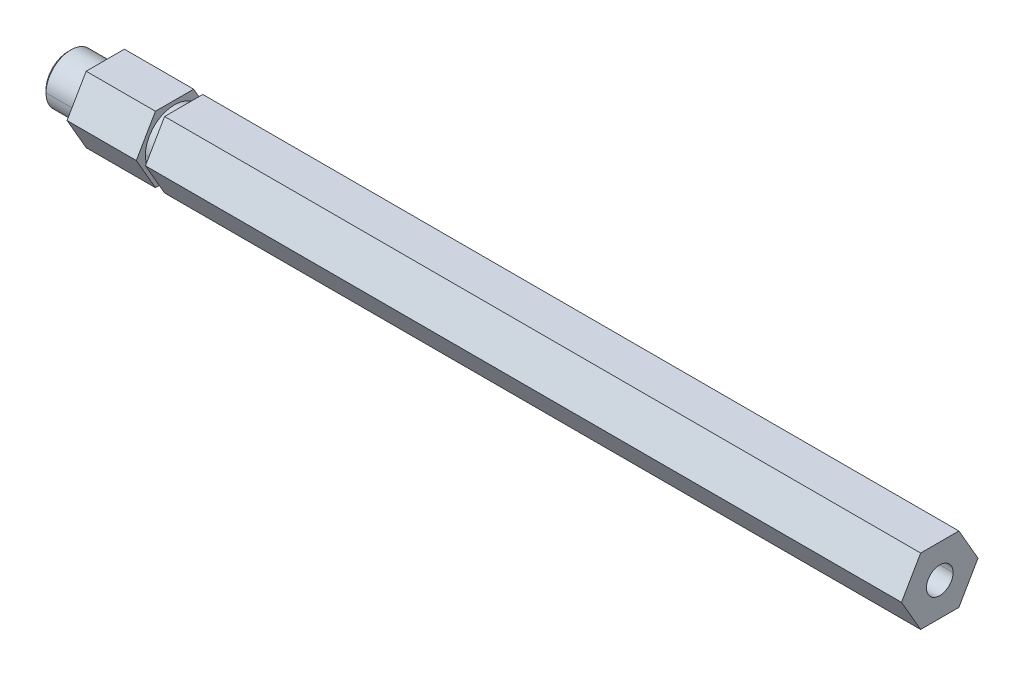
ISO-10303-21;
HEADER;
FILE_DESCRIPTION(('STEP AP214'),'2;1');
FILE_NAME('part.step','',(''),(''),'','','');
FILE_SCHEMA(('AUTOMOTIVE_DESIGN { 1 0 10303 214 1 1 1 1 }'));
ENDSEC;
DATA;
#1=APPLICATION_CONTEXT('core data for automotive mechanical design processes');
#2=APPLICATION_PROTOCOL_DEFINITION('international standard','automotive_design',2000,#1);
#3=PRODUCT_CONTEXT('',#1,'mechanical');
#4=PRODUCT('Part','Part','',(#3));
#5=PRODUCT_RELATED_PRODUCT_CATEGORY('part','',(#4));
#6=PRODUCT_DEFINITION_FORMATION('','',#4);
#7=PRODUCT_DEFINITION_CONTEXT('part definition',#1,'design');
#8=PRODUCT_DEFINITION('design','',#6,#7);
#9=PRODUCT_DEFINITION_SHAPE('','',#8);
#10=(LENGTH_UNIT() NAMED_UNIT(*) SI_UNIT(.MILLI.,.METRE.));
#11=(NAMED_UNIT(*) PLANE_ANGLE_UNIT() SI_UNIT($,.RADIAN.));
#12=(NAMED_UNIT(*) SI_UNIT($,.STERADIAN.) SOLID_ANGLE_UNIT());
#13=UNCERTAINTY_MEASURE_WITH_UNIT(LENGTH_MEASURE(1.E-05),#10,'distance_accuracy_value','');
#14=(GEOMETRIC_REPRESENTATION_CONTEXT(3) GLOBAL_UNCERTAINTY_ASSIGNED_CONTEXT((#13)) GLOBAL_UNIT_ASSIGNED_CONTEXT((#10,
#11,#12)) REPRESENTATION_CONTEXT('',''));
#15=CARTESIAN_POINT('',(0.,0.,0.));
#16=DIRECTION('',(0.,0.,1.));
#17=DIRECTION('',(1.,0.,0.));
#18=AXIS2_PLACEMENT_3D('',#15,#16,#17);
#19=CARTESIAN_POINT('',(0.507999999999975,0.,0.));
#20=DIRECTION('',(1.,0.,0.));
#21=DIRECTION('',(0.,0.,-1.));
#22=AXIS2_PLACEMENT_3D('',#19,#20,#21);
#23=CONICAL_SURFACE('',#22,4.7625,0.785398163397452);
#24=CARTESIAN_POINT('',(0.,0.,0.));
#25=DIRECTION('',(-1.,0.,0.));
#26=DIRECTION('',(0.,0.,-1.));
#27=AXIS2_PLACEMENT_3D('',#24,#25,#26);
#28=CIRCLE('',#27,4.2545);
#29=CARTESIAN_POINT('',(0.,0.,4.2545));
#30=VERTEX_POINT('',#29);
#31=CARTESIAN_POINT('',(0.,0.,-4.2545));
#32=VERTEX_POINT('',#31);
#33=EDGE_CURVE('E41',#30,#32,#28,.T.);
#34=ORIENTED_EDGE('',*,*,#33,.F.);
#35=DIRECTION('',(0.707106781186545,0.,0.70710678118655));
#36=VECTOR('',#35,1.);
#37=CARTESIAN_POINT('',(0.507999999999975,0.,4.7625));
#38=LINE('',#37,#36);
#39=CARTESIAN_POINT('',(0.507999999999975,0.,4.7625));
#40=VERTEX_POINT('',#39);
#41=EDGE_CURVE('E11',#30,#40,#38,.T.);
#42=ORIENTED_EDGE('',*,*,#41,.T.);
#43=CARTESIAN_POINT('',(0.507999999999975,0.,0.));
#44=DIRECTION('',(1.,0.,0.));
#45=DIRECTION('',(0.,0.,-1.));
#46=AXIS2_PLACEMENT_3D('',#43,#44,#45);
#47=CIRCLE('',#46,4.7625);
#48=CARTESIAN_POINT('',(0.507999999999975,0.,-4.7625));
#49=VERTEX_POINT('',#48);
#50=EDGE_CURVE('E274',#49,#40,#47,.T.);
#51=ORIENTED_EDGE('',*,*,#50,.F.);
#52=DIRECTION('',(0.707106781186545,0.,-0.70710678118655));
#53=VECTOR('',#52,1.);
#54=CARTESIAN_POINT('',(0.507999999999975,0.,-4.7625));
#55=LINE('',#54,#53);
#56=EDGE_CURVE('E275',#32,#49,#55,.T.);
#57=ORIENTED_EDGE('',*,*,#56,.F.);
#58=EDGE_LOOP('',(#34,#42,#51,#57));
#59=FACE_BOUND('',#58,.T.);
#60=ADVANCED_FACE('F16',(#59),#23,.T.);
#61=CARTESIAN_POINT('',(0.,0.,0.));
#62=DIRECTION('',(-1.,0.,0.));
#63=DIRECTION('',(0.,0.,1.));
#64=AXIS2_PLACEMENT_3D('',#61,#62,#63);
#65=CYLINDRICAL_SURFACE('',#64,3.175);
#66=CARTESIAN_POINT('',(12.7,0.,0.));
#67=DIRECTION('',(-1.,0.,0.));
#68=DIRECTION('',(0.,0.,1.));
#69=AXIS2_PLACEMENT_3D('',#66,#67,#68);
#70=CIRCLE('',#69,3.175);
#71=CARTESIAN_POINT('',(12.7,0.,-3.175));
#72=VERTEX_POINT('',#71);
#73=CARTESIAN_POINT('',(12.7,0.,3.175));
#74=VERTEX_POINT('',#73);
#75=EDGE_CURVE('E340',#72,#74,#70,.T.);
#76=ORIENTED_EDGE('',*,*,#75,.F.);
#77=DIRECTION('',(-1.,0.,0.));
#78=VECTOR('',#77,1.);
#79=CARTESIAN_POINT('',(0.,0.,-3.175));
#80=LINE('',#79,#78);
#81=CARTESIAN_POINT('',(0.,0.,-3.175));
#82=VERTEX_POINT('',#81);
#83=EDGE_CURVE('E27',#72,#82,#80,.T.);
#84=ORIENTED_EDGE('',*,*,#83,.T.);
#85=CARTESIAN_POINT('',(0.,0.,0.));
#86=DIRECTION('',(-1.,0.,0.));
#87=DIRECTION('',(0.,0.,1.));
#88=AXIS2_PLACEMENT_3D('',#85,#86,#87);
#89=CIRCLE('',#88,3.175);
#90=CARTESIAN_POINT('',(0.,0.,3.175));
#91=VERTEX_POINT('',#90);
#92=EDGE_CURVE('E323',#82,#91,#89,.T.);
#93=ORIENTED_EDGE('',*,*,#92,.T.);
#94=DIRECTION('',(-1.,0.,0.));
#95=VECTOR('',#94,1.);
#96=CARTESIAN_POINT('',(0.,0.,3.175));
#97=LINE('',#96,#95);
#98=EDGE_CURVE('E498',#74,#91,#97,.T.);
#99=ORIENTED_EDGE('',*,*,#98,.F.);
#100=EDGE_LOOP('',(#76,#84,#93,#99));
#101=FACE_BOUND('',#100,.T.);
#102=ADVANCED_FACE('F18',(#101),#65,.F.);
#103=CARTESIAN_POINT('',(12.7,0.,0.));
#104=DIRECTION('',(-1.,0.,0.));
#105=DIRECTION('',(0.,0.,1.));
#106=AXIS2_PLACEMENT_3D('',#103,#104,#105);
#107=CONICAL_SURFACE('',#106,3.175,1.02974425867665);
#108=DIRECTION('',(-0.515038074910055,0.,0.857167300702112));
#109=VECTOR('',#108,1.);
#110=CARTESIAN_POINT('',(12.7,0.,3.175));
#111=LINE('',#110,#109);
#112=CARTESIAN_POINT('',(14.6077324654125,0.,0.));
#113=VERTEX_POINT('',#112);
#114=EDGE_CURVE('E507',#113,#74,#111,.T.);
#115=ORIENTED_EDGE('',*,*,#114,.F.);
#116=DIRECTION('',(-0.515038074910055,0.,-0.857167300702112));
#117=VECTOR('',#116,1.);
#118=CARTESIAN_POINT('',(12.7,0.,-3.175));
#119=LINE('',#118,#117);
#120=EDGE_CURVE('E332',#113,#72,#119,.T.);
#121=ORIENTED_EDGE('',*,*,#120,.T.);
#122=ORIENTED_EDGE('',*,*,#75,.T.);
#123=EDGE_LOOP('',(#115,#121,#122));
#124=FACE_BOUND('',#123,.T.);
#125=ADVANCED_FACE('F430',(#124),#107,.F.);
#126=CARTESIAN_POINT('',(167.132,0.,0.));
#127=DIRECTION('',(1.,0.,0.));
#128=DIRECTION('',(0.,0.,-1.));
#129=AXIS2_PLACEMENT_3D('',#126,#127,#128);
#130=CYLINDRICAL_SURFACE('',#129,2.5527);
#131=CARTESIAN_POINT('',(151.13,0.,0.));
#132=DIRECTION('',(1.,0.,0.));
#133=DIRECTION('',(0.,0.,-1.));
#134=AXIS2_PLACEMENT_3D('',#131,#132,#133);
#135=CIRCLE('',#134,2.5527);
#136=CARTESIAN_POINT('',(151.13,0.,2.5527));
#137=VERTEX_POINT('',#136);
#138=CARTESIAN_POINT('',(151.13,0.,-2.5527));
#139=VERTEX_POINT('',#138);
#140=EDGE_CURVE('E348',#137,#139,#135,.T.);
#141=ORIENTED_EDGE('',*,*,#140,.F.);
#142=DIRECTION('',(1.,0.,0.));
#143=VECTOR('',#142,1.);
#144=CARTESIAN_POINT('',(167.132,0.,2.5527));
#145=LINE('',#144,#143);
#146=CARTESIAN_POINT('',(167.132,0.,2.5527));
#147=VERTEX_POINT('',#146);
#148=EDGE_CURVE('E317',#137,#147,#145,.T.);
#149=ORIENTED_EDGE('',*,*,#148,.T.);
#150=CARTESIAN_POINT('',(167.132,0.,0.));
#151=DIRECTION('',(1.,0.,0.));
#152=DIRECTION('',(0.,0.,-1.));
#153=AXIS2_PLACEMENT_3D('',#150,#151,#152);
#154=CIRCLE('',#153,2.5527);
#155=CARTESIAN_POINT('',(167.132,0.,-2.5527));
#156=VERTEX_POINT('',#155);
#157=EDGE_CURVE('E313',#147,#156,#154,.T.);
#158=ORIENTED_EDGE('',*,*,#157,.T.);
#159=DIRECTION('',(1.,0.,0.));
#160=VECTOR('',#159,1.);
#161=CARTESIAN_POINT('',(167.132,0.,-2.5527));
#162=LINE('',#161,#160);
#163=EDGE_CURVE('E506',#139,#156,#162,.T.);
#164=ORIENTED_EDGE('',*,*,#163,.F.);
#165=EDGE_LOOP('',(#141,#149,#158,#164));
#166=FACE_BOUND('',#165,.T.);
#167=ADVANCED_FACE('F983',(#166),#130,.F.);
#168=CARTESIAN_POINT('',(151.13,0.,0.));
#169=DIRECTION('',(1.,0.,0.));
#170=DIRECTION('',(0.,0.,-1.));
#171=AXIS2_PLACEMENT_3D('',#168,#169,#170);
#172=CONICAL_SURFACE('',#171,2.5527,1.02974425867665);
#173=DIRECTION('',(0.515038074910061,0.,-0.857167300702108));
#174=VECTOR('',#173,1.);
#175=CARTESIAN_POINT('',(151.13,0.,-2.5527));
#176=LINE('',#175,#174);
#177=CARTESIAN_POINT('',(149.596183097808,0.,0.));
#178=VERTEX_POINT('',#177);
#179=EDGE_CURVE('E252',#178,#139,#176,.T.);
#180=ORIENTED_EDGE('',*,*,#179,.F.);
#181=DIRECTION('',(0.515038074910061,0.,0.857167300702108));
#182=VECTOR('',#181,1.);
#183=CARTESIAN_POINT('',(151.13,0.,2.5527));
#184=LINE('',#183,#182);
#185=EDGE_CURVE('E318',#178,#137,#184,.T.);
#186=ORIENTED_EDGE('',*,*,#185,.T.);
#187=ORIENTED_EDGE('',*,*,#140,.T.);
#188=EDGE_LOOP('',(#180,#186,#187));
#189=FACE_BOUND('',#188,.T.);
#190=ADVANCED_FACE('F943',(#189),#172,.F.);
#191=CARTESIAN_POINT('',(22.1488,0.,0.));
#192=DIRECTION('',(-1.,0.,0.));
#193=DIRECTION('',(0.,0.,1.));
#194=AXIS2_PLACEMENT_3D('',#191,#192,#193);
#195=CYLINDRICAL_SURFACE('',#194,5.588);
#196=CARTESIAN_POINT('',(22.1488,0.,0.));
#197=DIRECTION('',(1.,0.,0.));
#198=DIRECTION('',(0.,0.,-1.));
#199=AXIS2_PLACEMENT_3D('',#196,#197,#198);
#200=CIRCLE('',#199,5.588);
#201=CARTESIAN_POINT('',(22.1488,0.,-5.588));
#202=VERTEX_POINT('',#201);
#203=CARTESIAN_POINT('',(22.1488,0.,5.588));
#204=VERTEX_POINT('',#203);
#205=EDGE_CURVE('E256',#202,#204,#200,.T.);
#206=ORIENTED_EDGE('',*,*,#205,.F.);
#207=DIRECTION('',(-1.,0.,0.));
#208=VECTOR('',#207,1.);
#209=CARTESIAN_POINT('',(22.1488,0.,-5.588));
#210=LINE('',#209,#208);
#211=CARTESIAN_POINT('',(20.3962,0.,-5.588));
#212=VERTEX_POINT('',#211);
#213=EDGE_CURVE('E352',#202,#212,#210,.T.);
#214=ORIENTED_EDGE('',*,*,#213,.T.);
#215=CARTESIAN_POINT('',(20.3962,0.,0.));
#216=DIRECTION('',(1.,0.,0.));
#217=DIRECTION('',(0.,0.,-1.));
#218=AXIS2_PLACEMENT_3D('',#215,#216,#217);
#219=CIRCLE('',#218,5.588);
#220=CARTESIAN_POINT('',(20.3962,0.,5.588));
#221=VERTEX_POINT('',#220);
#222=EDGE_CURVE('E273',#212,#221,#219,.T.);
#223=ORIENTED_EDGE('',*,*,#222,.T.);
#224=DIRECTION('',(-1.,0.,0.));
#225=VECTOR('',#224,1.);
#226=CARTESIAN_POINT('',(22.1488,0.,5.588));
#227=LINE('',#226,#225);
#228=EDGE_CURVE('E306',#204,#221,#227,.T.);
#229=ORIENTED_EDGE('',*,*,#228,.F.);
#230=EDGE_LOOP('',(#206,#214,#223,#229));
#231=FACE_BOUND('',#230,.T.);
#232=ADVANCED_FACE('F398',(#231),#195,.T.);
#233=CARTESIAN_POINT('',(7.112,0.,0.));
#234=DIRECTION('',(-1.,0.,0.));
#235=DIRECTION('',(0.,0.,1.));
#236=AXIS2_PLACEMENT_3D('',#233,#234,#235);
#237=CYLINDRICAL_SURFACE('',#236,4.7625);
#238=CARTESIAN_POINT('',(7.112,0.,0.));
#239=DIRECTION('',(1.,0.,0.));
#240=DIRECTION('',(0.,0.,-1.));
#241=AXIS2_PLACEMENT_3D('',#238,#239,#240);
#242=CIRCLE('',#241,4.7625);
#243=CARTESIAN_POINT('',(7.112,0.,-4.7625));
#244=VERTEX_POINT('',#243);
#245=CARTESIAN_POINT('',(7.112,0.,4.7625));
#246=VERTEX_POINT('',#245);
#247=EDGE_CURVE('E265',#244,#246,#242,.T.);
#248=ORIENTED_EDGE('',*,*,#247,.F.);
#249=DIRECTION('',(-1.,0.,0.));
#250=VECTOR('',#249,1.);
#251=CARTESIAN_POINT('',(7.112,0.,-4.7625));
#252=LINE('',#251,#250);
#253=EDGE_CURVE('E269',#244,#49,#252,.T.);
#254=ORIENTED_EDGE('',*,*,#253,.T.);
#255=ORIENTED_EDGE('',*,*,#50,.T.);
#256=DIRECTION('',(-1.,0.,0.));
#257=VECTOR('',#256,1.);
#258=CARTESIAN_POINT('',(7.112,0.,4.7625));
#259=LINE('',#258,#257);
#260=EDGE_CURVE('E289',#246,#40,#259,.T.);
#261=ORIENTED_EDGE('',*,*,#260,.F.);
#262=EDGE_LOOP('',(#248,#254,#255,#261));
#263=FACE_BOUND('',#262,.T.);
#264=ADVANCED_FACE('F409',(#263),#237,.T.);
#265=CARTESIAN_POINT('',(20.3962,0.,0.));
#266=DIRECTION('',(1.,0.,0.));
#267=DIRECTION('',(0.,1.,0.));
#268=AXIS2_PLACEMENT_3D('',#265,#266,#267);
#269=PLANE('',#268);
#270=DIRECTION('',(0.,0.866025403784439,-0.5));
#271=VECTOR('',#270,1.);
#272=CARTESIAN_POINT('',(20.3962,-6.35,-3.66617420935412));
#273=LINE('',#272,#271);
#274=CARTESIAN_POINT('',(20.3962,-6.35,-3.66617420935412));
#275=VERTEX_POINT('',#274);
#276=CARTESIAN_POINT('',(20.3962,0.,-7.33234841870825));
#277=VERTEX_POINT('',#276);
#278=EDGE_CURVE('E359',#275,#277,#273,.T.);
#279=ORIENTED_EDGE('',*,*,#278,.T.);
#280=DIRECTION('',(0.,0.866025403784439,0.5));
#281=VECTOR('',#280,1.);
#282=CARTESIAN_POINT('',(20.3962,0.,-7.33234841870825));
#283=LINE('',#282,#281);
#284=CARTESIAN_POINT('',(20.3962,6.35,-3.66617420935412));
#285=VERTEX_POINT('',#284);
#286=EDGE_CURVE('E283',#277,#285,#283,.T.);
#287=ORIENTED_EDGE('',*,*,#286,.T.);
#288=DIRECTION('',(0.,0.,1.));
#289=VECTOR('',#288,1.);
#290=CARTESIAN_POINT('',(20.3962,6.35,-3.66617420935412));
#291=LINE('',#290,#289);
#292=CARTESIAN_POINT('',(20.3962,6.35,3.66617420935412));
#293=VERTEX_POINT('',#292);
#294=EDGE_CURVE('E279',#285,#293,#291,.T.);
#295=ORIENTED_EDGE('',*,*,#294,.T.);
#296=DIRECTION('',(0.,-0.866025403784439,0.5));
#297=VECTOR('',#296,1.);
#298=CARTESIAN_POINT('',(20.3962,6.35,3.66617420935412));
#299=LINE('',#298,#297);
#300=CARTESIAN_POINT('',(20.3962,0.,7.33234841870825));
#301=VERTEX_POINT('',#300);
#302=EDGE_CURVE('E284',#293,#301,#299,.T.);
#303=ORIENTED_EDGE('',*,*,#302,.T.);
#304=DIRECTION('',(0.,-0.866025403784438,-0.5));
#305=VECTOR('',#304,1.);
#306=CARTESIAN_POINT('',(20.3962,0.,7.33234841870825));
#307=LINE('',#306,#305);
#308=CARTESIAN_POINT('',(20.3962,-6.35,3.66617420935412));
#309=VERTEX_POINT('',#308);
#310=EDGE_CURVE('E515',#301,#309,#307,.T.);
#311=ORIENTED_EDGE('',*,*,#310,.T.);
#312=DIRECTION('',(0.,0.,-1.));
#313=VECTOR('',#312,1.);
#314=CARTESIAN_POINT('',(20.3962,-6.35,3.66617420935412));
#315=LINE('',#314,#313);
#316=EDGE_CURVE('E544',#309,#275,#315,.T.);
#317=ORIENTED_EDGE('',*,*,#316,.T.);
#318=EDGE_LOOP('',(#279,#287,#295,#303,#311,#317));
#319=FACE_BOUND('',#318,.T.);
#320=CARTESIAN_POINT('',(20.3962,0.,0.));
#321=DIRECTION('',(1.,0.,0.));
#322=DIRECTION('',(0.,0.,-1.));
#323=AXIS2_PLACEMENT_3D('',#320,#321,#322);
#324=CIRCLE('',#323,5.588);
#325=EDGE_CURVE('E302',#221,#212,#324,.T.);
#326=ORIENTED_EDGE('',*,*,#325,.F.);
#327=ORIENTED_EDGE('',*,*,#222,.F.);
#328=EDGE_LOOP('',(#326,#327));
#329=FACE_BOUND('',#328,.T.);
#330=ADVANCED_FACE('F406',(#319,#329),#269,.T.);
#331=CARTESIAN_POINT('',(7.112,0.,0.));
#332=DIRECTION('',(-1.,0.,0.));
#333=DIRECTION('',(0.,0.,1.));
#334=AXIS2_PLACEMENT_3D('',#331,#332,#333);
#335=CYLINDRICAL_SURFACE('',#334,4.7625);
#336=ORIENTED_EDGE('',*,*,#253,.F.);
#337=CARTESIAN_POINT('',(7.112,0.,0.));
#338=DIRECTION('',(1.,0.,0.));
#339=DIRECTION('',(0.,0.,-1.));
#340=AXIS2_PLACEMENT_3D('',#337,#338,#339);
#341=CIRCLE('',#340,4.7625);
#342=EDGE_CURVE('E261',#246,#244,#341,.T.);
#343=ORIENTED_EDGE('',*,*,#342,.F.);
#344=ORIENTED_EDGE('',*,*,#260,.T.);
#345=CARTESIAN_POINT('',(0.507999999999975,0.,0.));
#346=DIRECTION('',(1.,0.,0.));
#347=DIRECTION('',(0.,0.,-1.));
#348=AXIS2_PLACEMENT_3D('',#345,#346,#347);
#349=CIRCLE('',#348,4.7625);
#350=EDGE_CURVE('E285',#40,#49,#349,.T.);
#351=ORIENTED_EDGE('',*,*,#350,.T.);
#352=EDGE_LOOP('',(#336,#343,#344,#351));
#353=FACE_BOUND('',#352,.T.);
#354=ADVANCED_FACE('F408',(#353),#335,.T.);
#355=CARTESIAN_POINT('',(0.,0.,0.));
#356=DIRECTION('',(1.,0.,0.));
#357=DIRECTION('',(0.,1.,0.));
#358=AXIS2_PLACEMENT_3D('',#355,#356,#357);
#359=PLANE('',#358);
#360=CARTESIAN_POINT('',(0.,0.,0.));
#361=DIRECTION('',(-1.,0.,0.));
#362=DIRECTION('',(0.,0.,-1.));
#363=AXIS2_PLACEMENT_3D('',#360,#361,#362);
#364=CIRCLE('',#363,4.2545);
#365=EDGE_CURVE('E290',#32,#30,#364,.T.);
#366=ORIENTED_EDGE('',*,*,#365,.T.);
#367=ORIENTED_EDGE('',*,*,#33,.T.);
#368=EDGE_LOOP('',(#366,#367));
#369=FACE_BOUND('',#368,.T.);
#370=CARTESIAN_POINT('',(0.,0.,0.));
#371=DIRECTION('',(-1.,0.,0.));
#372=DIRECTION('',(0.,0.,1.));
#373=AXIS2_PLACEMENT_3D('',#370,#371,#372);
#374=CIRCLE('',#373,3.175);
#375=EDGE_CURVE('E278',#91,#82,#374,.T.);
#376=ORIENTED_EDGE('',*,*,#375,.F.);
#377=ORIENTED_EDGE('',*,*,#92,.F.);
#378=EDGE_LOOP('',(#376,#377));
#379=FACE_BOUND('',#378,.T.);
#380=ADVANCED_FACE('F418',(#369,#379),#359,.F.);
#381=CARTESIAN_POINT('',(7.112,0.,0.));
#382=DIRECTION('',(1.,0.,0.));
#383=DIRECTION('',(0.,1.,0.));
#384=AXIS2_PLACEMENT_3D('',#381,#382,#383);
#385=PLANE('',#384);
#386=DIRECTION('',(0.,0.866025403784439,-0.5));
#387=VECTOR('',#386,1.);
#388=CARTESIAN_POINT('',(7.112,-6.35,-3.66617420935412));
#389=LINE('',#388,#387);
#390=CARTESIAN_POINT('',(7.112,-6.35,-3.66617420935412));
#391=VERTEX_POINT('',#390);
#392=CARTESIAN_POINT('',(7.112,0.,-7.33234841870825));
#393=VERTEX_POINT('',#392);
#394=EDGE_CURVE('E311',#391,#393,#389,.T.);
#395=ORIENTED_EDGE('',*,*,#394,.F.);
#396=DIRECTION('',(0.,0.,-1.));
#397=VECTOR('',#396,1.);
#398=CARTESIAN_POINT('',(7.112,-6.35,3.66617420935412));
#399=LINE('',#398,#397);
#400=CARTESIAN_POINT('',(7.112,-6.35,3.66617420935412));
#401=VERTEX_POINT('',#400);
#402=EDGE_CURVE('E164',#401,#391,#399,.T.);
#403=ORIENTED_EDGE('',*,*,#402,.F.);
#404=DIRECTION('',(0.,-0.866025403784438,-0.5));
#405=VECTOR('',#404,1.);
#406=CARTESIAN_POINT('',(7.112,0.,7.33234841870825));
#407=LINE('',#406,#405);
#408=CARTESIAN_POINT('',(7.112,0.,7.33234841870825));
#409=VERTEX_POINT('',#408);
#410=EDGE_CURVE('E368',#409,#401,#407,.T.);
#411=ORIENTED_EDGE('',*,*,#410,.F.);
#412=DIRECTION('',(0.,-0.866025403784439,0.5));
#413=VECTOR('',#412,1.);
#414=CARTESIAN_POINT('',(7.112,6.35,3.66617420935412));
#415=LINE('',#414,#413);
#416=CARTESIAN_POINT('',(7.112,6.35,3.66617420935412));
#417=VERTEX_POINT('',#416);
#418=EDGE_CURVE('E291',#417,#409,#415,.T.);
#419=ORIENTED_EDGE('',*,*,#418,.F.);
#420=DIRECTION('',(0.,0.,1.));
#421=VECTOR('',#420,1.);
#422=CARTESIAN_POINT('',(7.112,6.35,-3.66617420935412));
#423=LINE('',#422,#421);
#424=CARTESIAN_POINT('',(7.112,6.35,-3.66617420935412));
#425=VERTEX_POINT('',#424);
#426=EDGE_CURVE('E360',#425,#417,#423,.T.);
#427=ORIENTED_EDGE('',*,*,#426,.F.);
#428=DIRECTION('',(0.,0.866025403784439,0.5));
#429=VECTOR('',#428,1.);
#430=CARTESIAN_POINT('',(7.112,0.,-7.33234841870825));
#431=LINE('',#430,#429);
#432=EDGE_CURVE('E312',#393,#425,#431,.T.);
#433=ORIENTED_EDGE('',*,*,#432,.F.);
#434=EDGE_LOOP('',(#395,#403,#411,#419,#427,#433));
#435=FACE_BOUND('',#434,.T.);
#436=ORIENTED_EDGE('',*,*,#342,.T.);
#437=ORIENTED_EDGE('',*,*,#247,.T.);
#438=EDGE_LOOP('',(#436,#437));
#439=FACE_BOUND('',#438,.T.);
#440=ADVANCED_FACE('F432',(#435,#439),#385,.F.);
#441=CARTESIAN_POINT('',(20.3962,-6.35,-3.66617420935412));
#442=DIRECTION('',(0.,0.5,0.866025403784439));
#443=DIRECTION('',(1.,0.,0.));
#444=AXIS2_PLACEMENT_3D('',#441,#442,#443);
#445=PLANE('',#444);
#446=ORIENTED_EDGE('',*,*,#394,.T.);
#447=DIRECTION('',(-1.,0.,0.));
#448=VECTOR('',#447,1.);
#449=CARTESIAN_POINT('',(20.3962,0.,-7.33234841870825));
#450=LINE('',#449,#448);
#451=EDGE_CURVE('E364',#277,#393,#450,.T.);
#452=ORIENTED_EDGE('',*,*,#451,.F.);
#453=ORIENTED_EDGE('',*,*,#278,.F.);
#454=DIRECTION('',(-1.,0.,0.));
#455=VECTOR('',#454,1.);
#456=CARTESIAN_POINT('',(20.3962,-6.35,-3.66617420935412));
#457=LINE('',#456,#455);
#458=EDGE_CURVE('E307',#275,#391,#457,.T.);
#459=ORIENTED_EDGE('',*,*,#458,.T.);
#460=EDGE_LOOP('',(#446,#452,#453,#459));
#461=FACE_BOUND('',#460,.T.);
#462=ADVANCED_FACE('F435',(#461),#445,.F.);
#463=CARTESIAN_POINT('',(20.3962,0.,-7.33234841870825));
#464=DIRECTION('',(0.,-0.5,0.866025403784439));
#465=DIRECTION('',(-1.,0.,0.));
#466=AXIS2_PLACEMENT_3D('',#463,#464,#465);
#467=PLANE('',#466);
#468=ORIENTED_EDGE('',*,*,#432,.T.);
#469=DIRECTION('',(-1.,0.,0.));
#470=VECTOR('',#469,1.);
#471=CARTESIAN_POINT('',(20.3962,6.35,-3.66617420935412));
#472=LINE('',#471,#470);
#473=EDGE_CURVE('E295',#285,#425,#472,.T.);
#474=ORIENTED_EDGE('',*,*,#473,.F.);
#475=ORIENTED_EDGE('',*,*,#286,.F.);
#476=ORIENTED_EDGE('',*,*,#451,.T.);
#477=EDGE_LOOP('',(#468,#474,#475,#476));
#478=FACE_BOUND('',#477,.T.);
#479=ADVANCED_FACE('F948',(#478),#467,.F.);
#480=CARTESIAN_POINT('',(20.3962,6.35,-3.66617420935412));
#481=DIRECTION('',(0.,-1.,0.));
#482=DIRECTION('',(0.,0.,-1.));
#483=AXIS2_PLACEMENT_3D('',#480,#481,#482);
#484=PLANE('',#483);
#485=ORIENTED_EDGE('',*,*,#426,.T.);
#486=DIRECTION('',(-1.,0.,0.));
#487=VECTOR('',#486,1.);
#488=CARTESIAN_POINT('',(20.3962,6.35,3.66617420935412));
#489=LINE('',#488,#487);
#490=EDGE_CURVE('E296',#293,#417,#489,.T.);
#491=ORIENTED_EDGE('',*,*,#490,.F.);
#492=ORIENTED_EDGE('',*,*,#294,.F.);
#493=ORIENTED_EDGE('',*,*,#473,.T.);
#494=EDGE_LOOP('',(#485,#491,#492,#493));
#495=FACE_BOUND('',#494,.T.);
#496=ADVANCED_FACE('F440',(#495),#484,.F.);
#497=CARTESIAN_POINT('',(20.3962,6.35,3.66617420935412));
#498=DIRECTION('',(0.,-0.5,-0.866025403784439));
#499=DIRECTION('',(0.,-0.866025403784439,0.5));
#500=AXIS2_PLACEMENT_3D('',#497,#498,#499);
#501=PLANE('',#500);
#502=ORIENTED_EDGE('',*,*,#418,.T.);
#503=DIRECTION('',(-1.,0.,0.));
#504=VECTOR('',#503,1.);
#505=CARTESIAN_POINT('',(20.3962,0.,7.33234841870825));
#506=LINE('',#505,#504);
#507=EDGE_CURVE('E510',#301,#409,#506,.T.);
#508=ORIENTED_EDGE('',*,*,#507,.F.);
#509=ORIENTED_EDGE('',*,*,#302,.F.);
#510=ORIENTED_EDGE('',*,*,#490,.T.);
#511=EDGE_LOOP('',(#502,#508,#509,#510));
#512=FACE_BOUND('',#511,.T.);
#513=ADVANCED_FACE('F436',(#512),#501,.F.);
#514=CARTESIAN_POINT('',(20.3962,0.,7.33234841870825));
#515=DIRECTION('',(0.,0.5,-0.866025403784439));
#516=DIRECTION('',(-1.,0.,0.));
#517=AXIS2_PLACEMENT_3D('',#514,#515,#516);
#518=PLANE('',#517);
#519=ORIENTED_EDGE('',*,*,#410,.T.);
#520=DIRECTION('',(-1.,0.,0.));
#521=VECTOR('',#520,1.);
#522=CARTESIAN_POINT('',(20.3962,-6.35,3.66617420935412));
#523=LINE('',#522,#521);
#524=EDGE_CURVE('E511',#309,#401,#523,.T.);
#525=ORIENTED_EDGE('',*,*,#524,.F.);
#526=ORIENTED_EDGE('',*,*,#310,.F.);
#527=ORIENTED_EDGE('',*,*,#507,.T.);
#528=EDGE_LOOP('',(#519,#525,#526,#527));
#529=FACE_BOUND('',#528,.T.);
#530=ADVANCED_FACE('F439',(#529),#518,.F.);
#531=CARTESIAN_POINT('',(20.3962,-6.35,3.66617420935412));
#532=DIRECTION('',(0.,1.,0.));
#533=DIRECTION('',(1.,0.,0.));
#534=AXIS2_PLACEMENT_3D('',#531,#532,#533);
#535=PLANE('',#534);
#536=ORIENTED_EDGE('',*,*,#402,.T.);
#537=ORIENTED_EDGE('',*,*,#458,.F.);
#538=ORIENTED_EDGE('',*,*,#316,.F.);
#539=ORIENTED_EDGE('',*,*,#524,.T.);
#540=EDGE_LOOP('',(#536,#537,#538,#539));
#541=FACE_BOUND('',#540,.T.);
#542=ADVANCED_FACE('F444',(#541),#535,.F.);
#543=CARTESIAN_POINT('',(22.1488,0.,0.));
#544=DIRECTION('',(-1.,0.,0.));
#545=DIRECTION('',(0.,0.,1.));
#546=AXIS2_PLACEMENT_3D('',#543,#544,#545);
#547=CYLINDRICAL_SURFACE('',#546,5.588);
#548=ORIENTED_EDGE('',*,*,#213,.F.);
#549=CARTESIAN_POINT('',(22.1488,0.,0.));
#550=DIRECTION('',(1.,0.,0.));
#551=DIRECTION('',(0.,0.,-1.));
#552=AXIS2_PLACEMENT_3D('',#549,#550,#551);
#553=CIRCLE('',#552,5.588);
#554=EDGE_CURVE('E259',#204,#202,#553,.T.);
#555=ORIENTED_EDGE('',*,*,#554,.F.);
#556=ORIENTED_EDGE('',*,*,#228,.T.);
#557=ORIENTED_EDGE('',*,*,#325,.T.);
#558=EDGE_LOOP('',(#548,#555,#556,#557));
#559=FACE_BOUND('',#558,.T.);
#560=ADVANCED_FACE('F404',(#559),#547,.T.);
#561=CARTESIAN_POINT('',(22.1488,0.,0.));
#562=DIRECTION('',(1.,0.,0.));
#563=DIRECTION('',(0.,1.,0.));
#564=AXIS2_PLACEMENT_3D('',#561,#562,#563);
#565=PLANE('',#564);
#566=DIRECTION('',(0.,0.866025403784439,-0.5));
#567=VECTOR('',#566,1.);
#568=CARTESIAN_POINT('',(22.1488,-6.35,-3.66617420935412));
#569=LINE('',#568,#567);
#570=CARTESIAN_POINT('',(22.1488,-6.35,-3.66617420935412));
#571=VERTEX_POINT('',#570);
#572=CARTESIAN_POINT('',(22.1488,0.,-7.33234841870824));
#573=VERTEX_POINT('',#572);
#574=EDGE_CURVE('E260',#571,#573,#569,.T.);
#575=ORIENTED_EDGE('',*,*,#574,.F.);
#576=DIRECTION('',(0.,0.,-1.));
#577=VECTOR('',#576,1.);
#578=CARTESIAN_POINT('',(22.1488,-6.35,3.66617420935412));
#579=LINE('',#578,#577);
#580=CARTESIAN_POINT('',(22.1488,-6.35,3.66617420935412));
#581=VERTEX_POINT('',#580);
#582=EDGE_CURVE('E239',#581,#571,#579,.T.);
#583=ORIENTED_EDGE('',*,*,#582,.F.);
#584=DIRECTION('',(0.,-0.866025403784439,-0.5));
#585=VECTOR('',#584,1.);
#586=CARTESIAN_POINT('',(22.1488,0.,7.33234841870824));
#587=LINE('',#586,#585);
#588=CARTESIAN_POINT('',(22.1488,0.,7.33234841870824));
#589=VERTEX_POINT('',#588);
#590=EDGE_CURVE('E238',#589,#581,#587,.T.);
#591=ORIENTED_EDGE('',*,*,#590,.F.);
#592=DIRECTION('',(0.,-0.866025403784439,0.5));
#593=VECTOR('',#592,1.);
#594=CARTESIAN_POINT('',(22.1488,6.35,3.66617420935412));
#595=LINE('',#594,#593);
#596=CARTESIAN_POINT('',(22.1488,6.35,3.66617420935412));
#597=VERTEX_POINT('',#596);
#598=EDGE_CURVE('E234',#597,#589,#595,.T.);
#599=ORIENTED_EDGE('',*,*,#598,.F.);
#600=DIRECTION('',(0.,0.,1.));
#601=VECTOR('',#600,1.);
#602=CARTESIAN_POINT('',(22.1488,6.35,-3.66617420935412));
#603=LINE('',#602,#601);
#604=CARTESIAN_POINT('',(22.1488,6.35,-3.66617420935412));
#605=VERTEX_POINT('',#604);
#606=EDGE_CURVE('E374',#605,#597,#603,.T.);
#607=ORIENTED_EDGE('',*,*,#606,.F.);
#608=DIRECTION('',(0.,0.866025403784439,0.5));
#609=VECTOR('',#608,1.);
#610=CARTESIAN_POINT('',(22.1488,0.,-7.33234841870824));
#611=LINE('',#610,#609);
#612=EDGE_CURVE('E301',#573,#605,#611,.T.);
#613=ORIENTED_EDGE('',*,*,#612,.F.);
#614=EDGE_LOOP('',(#575,#583,#591,#599,#607,#613));
#615=FACE_BOUND('',#614,.T.);
#616=ORIENTED_EDGE('',*,*,#554,.T.);
#617=ORIENTED_EDGE('',*,*,#205,.T.);
#618=EDGE_LOOP('',(#616,#617));
#619=FACE_BOUND('',#618,.T.);
#620=ADVANCED_FACE('F446',(#615,#619),#565,.F.);
#621=CARTESIAN_POINT('',(167.132,-6.35,-3.66617420935412));
#622=DIRECTION('',(0.,0.5,0.866025403784439));
#623=DIRECTION('',(1.,0.,0.));
#624=AXIS2_PLACEMENT_3D('',#621,#622,#623);
#625=PLANE('',#624);
#626=ORIENTED_EDGE('',*,*,#574,.T.);
#627=DIRECTION('',(-1.,0.,0.));
#628=VECTOR('',#627,1.);
#629=CARTESIAN_POINT('',(167.132,0.,-7.33234841870824));
#630=LINE('',#629,#628);
#631=CARTESIAN_POINT('',(167.132,0.,-7.33234841870824));
#632=VERTEX_POINT('',#631);
#633=EDGE_CURVE('E378',#632,#573,#630,.T.);
#634=ORIENTED_EDGE('',*,*,#633,.F.);
#635=DIRECTION('',(0.,0.866025403784439,-0.5));
#636=VECTOR('',#635,1.);
#637=CARTESIAN_POINT('',(167.132,-6.35,-3.66617420935412));
#638=LINE('',#637,#636);
#639=CARTESIAN_POINT('',(167.132,-6.35,-3.66617420935412));
#640=VERTEX_POINT('',#639);
#641=EDGE_CURVE('E486',#640,#632,#638,.T.);
#642=ORIENTED_EDGE('',*,*,#641,.F.);
#643=DIRECTION('',(-1.,0.,0.));
#644=VECTOR('',#643,1.);
#645=CARTESIAN_POINT('',(167.132,-6.35,-3.66617420935412));
#646=LINE('',#645,#644);
#647=EDGE_CURVE('E297',#640,#571,#646,.T.);
#648=ORIENTED_EDGE('',*,*,#647,.T.);
#649=EDGE_LOOP('',(#626,#634,#642,#648));
#650=FACE_BOUND('',#649,.T.);
#651=ADVANCED_FACE('F449',(#650),#625,.F.);
#652=CARTESIAN_POINT('',(167.132,0.,-7.33234841870824));
#653=DIRECTION('',(0.,-0.5,0.866025403784438));
#654=DIRECTION('',(-1.,0.,0.));
#655=AXIS2_PLACEMENT_3D('',#652,#653,#654);
#656=PLANE('',#655);
#657=ORIENTED_EDGE('',*,*,#612,.T.);
#658=DIRECTION('',(-1.,0.,0.));
#659=VECTOR('',#658,1.);
#660=CARTESIAN_POINT('',(167.132,6.35,-3.66617420935412));
#661=LINE('',#660,#659);
#662=CARTESIAN_POINT('',(167.132,6.35,-3.66617420935412));
#663=VERTEX_POINT('',#662);
#664=EDGE_CURVE('E379',#663,#605,#661,.T.);
#665=ORIENTED_EDGE('',*,*,#664,.F.);
#666=DIRECTION('',(0.,0.866025403784439,0.5));
#667=VECTOR('',#666,1.);
#668=CARTESIAN_POINT('',(167.132,0.,-7.33234841870824));
#669=LINE('',#668,#667);
#670=EDGE_CURVE('E20',#632,#663,#669,.T.);
#671=ORIENTED_EDGE('',*,*,#670,.F.);
#672=ORIENTED_EDGE('',*,*,#633,.T.);
#673=EDGE_LOOP('',(#657,#665,#671,#672));
#674=FACE_BOUND('',#673,.T.);
#675=ADVANCED_FACE('F462',(#674),#656,.F.);
#676=CARTESIAN_POINT('',(167.132,6.35,-3.66617420935412));
#677=DIRECTION('',(0.,-1.,0.));
#678=DIRECTION('',(0.,0.,-1.));
#679=AXIS2_PLACEMENT_3D('',#676,#677,#678);
#680=PLANE('',#679);
#681=ORIENTED_EDGE('',*,*,#606,.T.);
#682=DIRECTION('',(-1.,0.,0.));
#683=VECTOR('',#682,1.);
#684=CARTESIAN_POINT('',(167.132,6.35,3.66617420935412));
#685=LINE('',#684,#683);
#686=CARTESIAN_POINT('',(167.132,6.35,3.66617420935412));
#687=VERTEX_POINT('',#686);
#688=EDGE_CURVE('E266',#687,#597,#685,.T.);
#689=ORIENTED_EDGE('',*,*,#688,.F.);
#690=DIRECTION('',(0.,0.,1.));
#691=VECTOR('',#690,1.);
#692=CARTESIAN_POINT('',(167.132,6.35,-3.66617420935412));
#693=LINE('',#692,#691);
#694=EDGE_CURVE('E224',#663,#687,#693,.T.);
#695=ORIENTED_EDGE('',*,*,#694,.F.);
#696=ORIENTED_EDGE('',*,*,#664,.T.);
#697=EDGE_LOOP('',(#681,#689,#695,#696));
#698=FACE_BOUND('',#697,.T.);
#699=ADVANCED_FACE('F459',(#698),#680,.F.);
#700=CARTESIAN_POINT('',(167.132,6.35,3.66617420935412));
#701=DIRECTION('',(0.,-0.5,-0.866025403784439));
#702=DIRECTION('',(0.,-0.866025403784439,0.5));
#703=AXIS2_PLACEMENT_3D('',#700,#701,#702);
#704=PLANE('',#703);
#705=ORIENTED_EDGE('',*,*,#598,.T.);
#706=DIRECTION('',(-1.,0.,0.));
#707=VECTOR('',#706,1.);
#708=CARTESIAN_POINT('',(167.132,0.,7.33234841870824));
#709=LINE('',#708,#707);
#710=CARTESIAN_POINT('',(167.132,0.,7.33234841870824));
#711=VERTEX_POINT('',#710);
#712=EDGE_CURVE('E232',#711,#589,#709,.T.);
#713=ORIENTED_EDGE('',*,*,#712,.F.);
#714=DIRECTION('',(0.,-0.866025403784439,0.5));
#715=VECTOR('',#714,1.);
#716=CARTESIAN_POINT('',(167.132,6.35,3.66617420935412));
#717=LINE('',#716,#715);
#718=EDGE_CURVE('E215',#687,#711,#717,.T.);
#719=ORIENTED_EDGE('',*,*,#718,.F.);
#720=ORIENTED_EDGE('',*,*,#688,.T.);
#721=EDGE_LOOP('',(#705,#713,#719,#720));
#722=FACE_BOUND('',#721,.T.);
#723=ADVANCED_FACE('F233',(#722),#704,.F.);
#724=CARTESIAN_POINT('',(167.132,0.,7.33234841870824));
#725=DIRECTION('',(0.,0.5,-0.866025403784438));
#726=DIRECTION('',(-1.,0.,0.));
#727=AXIS2_PLACEMENT_3D('',#724,#725,#726);
#728=PLANE('',#727);
#729=ORIENTED_EDGE('',*,*,#590,.T.);
#730=DIRECTION('',(-1.,0.,0.));
#731=VECTOR('',#730,1.);
#732=CARTESIAN_POINT('',(167.132,-6.35,3.66617420935412));
#733=LINE('',#732,#731);
#734=CARTESIAN_POINT('',(167.132,-6.35,3.66617420935412));
#735=VERTEX_POINT('',#734);
#736=EDGE_CURVE('E243',#735,#581,#733,.T.);
#737=ORIENTED_EDGE('',*,*,#736,.F.);
#738=DIRECTION('',(0.,-0.866025403784439,-0.5));
#739=VECTOR('',#738,1.);
#740=CARTESIAN_POINT('',(167.132,0.,7.33234841870824));
#741=LINE('',#740,#739);
#742=EDGE_CURVE('E221',#711,#735,#741,.T.);
#743=ORIENTED_EDGE('',*,*,#742,.F.);
#744=ORIENTED_EDGE('',*,*,#712,.T.);
#745=EDGE_LOOP('',(#729,#737,#743,#744));
#746=FACE_BOUND('',#745,.T.);
#747=ADVANCED_FACE('F241',(#746),#728,.F.);
#748=CARTESIAN_POINT('',(167.132,-6.35,3.66617420935412));
#749=DIRECTION('',(0.,1.,0.));
#750=DIRECTION('',(1.,0.,0.));
#751=AXIS2_PLACEMENT_3D('',#748,#749,#750);
#752=PLANE('',#751);
#753=ORIENTED_EDGE('',*,*,#582,.T.);
#754=ORIENTED_EDGE('',*,*,#647,.F.);
#755=DIRECTION('',(0.,0.,-1.));
#756=VECTOR('',#755,1.);
#757=CARTESIAN_POINT('',(167.132,-6.35,3.66617420935412));
#758=LINE('',#757,#756);
#759=EDGE_CURVE('E246',#735,#640,#758,.T.);
#760=ORIENTED_EDGE('',*,*,#759,.F.);
#761=ORIENTED_EDGE('',*,*,#736,.T.);
#762=EDGE_LOOP('',(#753,#754,#760,#761));
#763=FACE_BOUND('',#762,.T.);
#764=ADVANCED_FACE('F453',(#763),#752,.F.);
#765=CARTESIAN_POINT('',(167.132,0.,0.));
#766=DIRECTION('',(1.,0.,0.));
#767=DIRECTION('',(0.,1.,0.));
#768=AXIS2_PLACEMENT_3D('',#765,#766,#767);
#769=PLANE('',#768);
#770=ORIENTED_EDGE('',*,*,#641,.T.);
#771=ORIENTED_EDGE('',*,*,#670,.T.);
#772=ORIENTED_EDGE('',*,*,#694,.T.);
#773=ORIENTED_EDGE('',*,*,#718,.T.);
#774=ORIENTED_EDGE('',*,*,#742,.T.);
#775=ORIENTED_EDGE('',*,*,#759,.T.);
#776=EDGE_LOOP('',(#770,#771,#772,#773,#774,#775));
#777=FACE_BOUND('',#776,.T.);
#778=CARTESIAN_POINT('',(167.132,0.,0.));
#779=DIRECTION('',(1.,0.,0.));
#780=DIRECTION('',(0.,0.,-1.));
#781=AXIS2_PLACEMENT_3D('',#778,#779,#780);
#782=CIRCLE('',#781,2.5527);
#783=EDGE_CURVE('E502',#156,#147,#782,.T.);
#784=ORIENTED_EDGE('',*,*,#783,.F.);
#785=ORIENTED_EDGE('',*,*,#157,.F.);
#786=EDGE_LOOP('',(#784,#785));
#787=FACE_BOUND('',#786,.T.);
#788=ADVANCED_FACE('F217',(#777,#787),#769,.T.);
#789=CARTESIAN_POINT('',(151.13,0.,0.));
#790=DIRECTION('',(1.,0.,0.));
#791=DIRECTION('',(0.,0.,-1.));
#792=AXIS2_PLACEMENT_3D('',#789,#790,#791);
#793=CONICAL_SURFACE('',#792,2.5527,1.02974425867665);
#794=ORIENTED_EDGE('',*,*,#185,.F.);
#795=ORIENTED_EDGE('',*,*,#179,.T.);
#796=CARTESIAN_POINT('',(151.13,0.,0.));
#797=DIRECTION('',(1.,0.,0.));
#798=DIRECTION('',(0.,0.,-1.));
#799=AXIS2_PLACEMENT_3D('',#796,#797,#798);
#800=CIRCLE('',#799,2.5527);
#801=EDGE_CURVE('E346',#139,#137,#800,.T.);
#802=ORIENTED_EDGE('',*,*,#801,.T.);
#803=EDGE_LOOP('',(#794,#795,#802));
#804=FACE_BOUND('',#803,.T.);
#805=ADVANCED_FACE('F454',(#804),#793,.F.);
#806=CARTESIAN_POINT('',(167.132,0.,0.));
#807=DIRECTION('',(1.,0.,0.));
#808=DIRECTION('',(0.,0.,-1.));
#809=AXIS2_PLACEMENT_3D('',#806,#807,#808);
#810=CYLINDRICAL_SURFACE('',#809,2.5527);
#811=ORIENTED_EDGE('',*,*,#148,.F.);
#812=ORIENTED_EDGE('',*,*,#801,.F.);
#813=ORIENTED_EDGE('',*,*,#163,.T.);
#814=ORIENTED_EDGE('',*,*,#783,.T.);
#815=EDGE_LOOP('',(#811,#812,#813,#814));
#816=FACE_BOUND('',#815,.T.);
#817=ADVANCED_FACE('F456',(#816),#810,.F.);
#818=CARTESIAN_POINT('',(12.7,0.,0.));
#819=DIRECTION('',(-1.,0.,0.));
#820=DIRECTION('',(0.,0.,1.));
#821=AXIS2_PLACEMENT_3D('',#818,#819,#820);
#822=CONICAL_SURFACE('',#821,3.175,1.02974425867665);
#823=ORIENTED_EDGE('',*,*,#120,.F.);
#824=ORIENTED_EDGE('',*,*,#114,.T.);
#825=CARTESIAN_POINT('',(12.7,0.,0.));
#826=DIRECTION('',(-1.,0.,0.));
#827=DIRECTION('',(0.,0.,1.));
#828=AXIS2_PLACEMENT_3D('',#825,#826,#827);
#829=CIRCLE('',#828,3.175);
#830=EDGE_CURVE('E523',#74,#72,#829,.T.);
#831=ORIENTED_EDGE('',*,*,#830,.T.);
#832=EDGE_LOOP('',(#823,#824,#831));
#833=FACE_BOUND('',#832,.T.);
#834=ADVANCED_FACE('F590',(#833),#822,.F.);
#835=CARTESIAN_POINT('',(0.,0.,0.));
#836=DIRECTION('',(-1.,0.,0.));
#837=DIRECTION('',(0.,0.,1.));
#838=AXIS2_PLACEMENT_3D('',#835,#836,#837);
#839=CYLINDRICAL_SURFACE('',#838,3.175);
#840=ORIENTED_EDGE('',*,*,#83,.F.);
#841=ORIENTED_EDGE('',*,*,#830,.F.);
#842=ORIENTED_EDGE('',*,*,#98,.T.);
#843=ORIENTED_EDGE('',*,*,#375,.T.);
#844=EDGE_LOOP('',(#840,#841,#842,#843));
#845=FACE_BOUND('',#844,.T.);
#846=ADVANCED_FACE('F468',(#845),#839,.F.);
#847=CARTESIAN_POINT('',(0.507999999999975,0.,0.));
#848=DIRECTION('',(1.,0.,0.));
#849=DIRECTION('',(0.,0.,-1.));
#850=AXIS2_PLACEMENT_3D('',#847,#848,#849);
#851=CONICAL_SURFACE('',#850,4.7625,0.785398163397452);
#852=ORIENTED_EDGE('',*,*,#41,.F.);
#853=ORIENTED_EDGE('',*,*,#365,.F.);
#854=ORIENTED_EDGE('',*,*,#56,.T.);
#855=ORIENTED_EDGE('',*,*,#350,.F.);
#856=EDGE_LOOP('',(#852,#853,#854,#855));
#857=FACE_BOUND('',#856,.T.);
#858=ADVANCED_FACE('F466',(#857),#851,.T.);
#859=CLOSED_SHELL('',(#60,#102,#125,#167,#190,#232,#264,#330,#354,#380,#440,#462,#479,#496,#513,
#530,#542,#560,#620,#651,#675,#699,#723,#747,#764,#788,#805,#817,#834,#846,#858));
#860=MANIFOLD_SOLID_BREP('B1',#859);
#861=ADVANCED_BREP_SHAPE_REPRESENTATION('',(#18,#860),#14);
#862=SHAPE_DEFINITION_REPRESENTATION(#9,#861);
ENDSEC;
END-ISO-10303-21;
